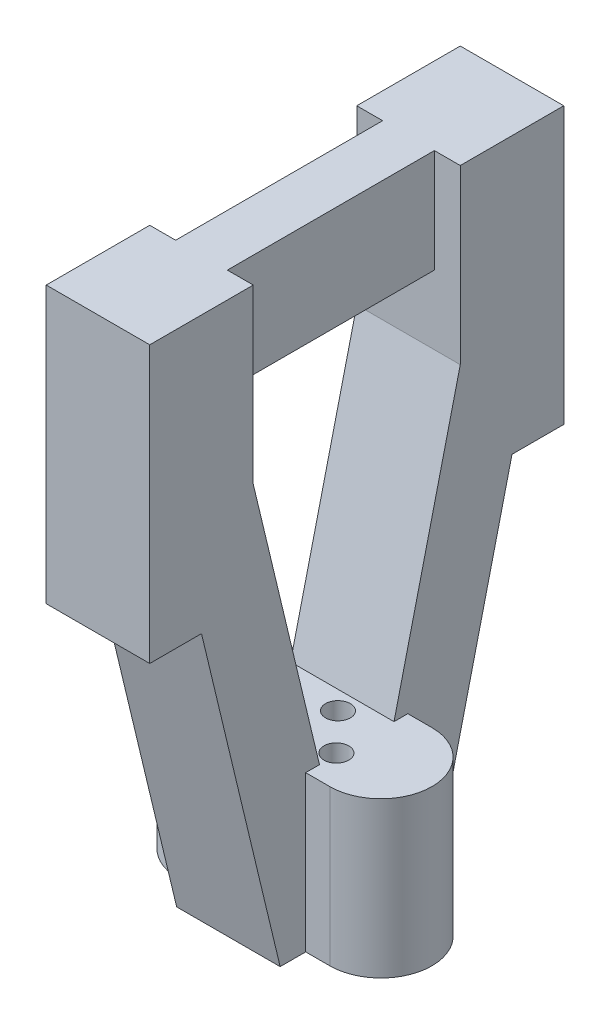
ISO-10303-21;
HEADER;
FILE_DESCRIPTION(('STEP AP214'),'2;1');
FILE_NAME('part.step','',(''),(''),'','','');
FILE_SCHEMA(('AUTOMOTIVE_DESIGN { 1 0 10303 214 1 1 1 1 }'));
ENDSEC;
DATA;
#1=APPLICATION_CONTEXT('core data for automotive mechanical design processes');
#2=APPLICATION_PROTOCOL_DEFINITION('international standard','automotive_design',2000,#1);
#3=PRODUCT_CONTEXT('',#1,'mechanical');
#4=PRODUCT('Part','Part','',(#3));
#5=PRODUCT_RELATED_PRODUCT_CATEGORY('part','',(#4));
#6=PRODUCT_DEFINITION_FORMATION('','',#4);
#7=PRODUCT_DEFINITION_CONTEXT('part definition',#1,'design');
#8=PRODUCT_DEFINITION('design','',#6,#7);
#9=PRODUCT_DEFINITION_SHAPE('','',#8);
#10=(LENGTH_UNIT() NAMED_UNIT(*) SI_UNIT(.MILLI.,.METRE.));
#11=(NAMED_UNIT(*) PLANE_ANGLE_UNIT() SI_UNIT($,.RADIAN.));
#12=(NAMED_UNIT(*) SI_UNIT($,.STERADIAN.) SOLID_ANGLE_UNIT());
#13=UNCERTAINTY_MEASURE_WITH_UNIT(LENGTH_MEASURE(1.E-05),#10,'distance_accuracy_value','');
#14=(GEOMETRIC_REPRESENTATION_CONTEXT(3) GLOBAL_UNCERTAINTY_ASSIGNED_CONTEXT((#13)) GLOBAL_UNIT_ASSIGNED_CONTEXT((#10,
#11,#12)) REPRESENTATION_CONTEXT('',''));
#15=CARTESIAN_POINT('',(0.,0.,0.));
#16=DIRECTION('',(0.,0.,1.));
#17=DIRECTION('',(1.,0.,0.));
#18=AXIS2_PLACEMENT_3D('',#15,#16,#17);
#19=CARTESIAN_POINT('',(-1.5,17.5,3.));
#20=DIRECTION('',(0.,0.,-1.));
#21=DIRECTION('',(0.,1.,0.));
#22=AXIS2_PLACEMENT_3D('',#19,#20,#21);
#23=PLANE('',#22);
#24=DIRECTION('',(-1.,0.,0.));
#25=VECTOR('',#24,1.);
#26=CARTESIAN_POINT('',(-0.75,14.5,3.));
#27=LINE('',#26,#25);
#28=CARTESIAN_POINT('',(0.749999999999999,14.5,3.));
#29=VERTEX_POINT('',#28);
#30=CARTESIAN_POINT('',(-0.75,14.5,3.));
#31=VERTEX_POINT('',#30);
#32=EDGE_CURVE('E49',#29,#31,#27,.T.);
#33=ORIENTED_EDGE('',*,*,#32,.F.);
#34=DIRECTION('',(0.,-1.,0.));
#35=VECTOR('',#34,1.);
#36=CARTESIAN_POINT('',(0.75,17.5,3.));
#37=LINE('',#36,#35);
#38=CARTESIAN_POINT('',(0.75,17.5,3.));
#39=VERTEX_POINT('',#38);
#40=EDGE_CURVE('E761',#39,#29,#37,.T.);
#41=ORIENTED_EDGE('',*,*,#40,.F.);
#42=DIRECTION('',(1.,0.,0.));
#43=VECTOR('',#42,1.);
#44=CARTESIAN_POINT('',(-1.5,17.5,3.));
#45=LINE('',#44,#43);
#46=CARTESIAN_POINT('',(1.5,17.5,3.));
#47=VERTEX_POINT('',#46);
#48=EDGE_CURVE('E336',#39,#47,#45,.T.);
#49=ORIENTED_EDGE('',*,*,#48,.T.);
#50=DIRECTION('',(0.,1.,0.));
#51=VECTOR('',#50,1.);
#52=CARTESIAN_POINT('',(1.5,17.5,3.));
#53=LINE('',#52,#51);
#54=CARTESIAN_POINT('',(1.5,12.5,3.));
#55=VERTEX_POINT('',#54);
#56=EDGE_CURVE('E298',#55,#47,#53,.T.);
#57=ORIENTED_EDGE('',*,*,#56,.F.);
#58=DIRECTION('',(1.,0.,0.));
#59=VECTOR('',#58,1.);
#60=CARTESIAN_POINT('',(-1.5,12.5,3.));
#61=LINE('',#60,#59);
#62=CARTESIAN_POINT('',(-1.5,12.5,3.));
#63=VERTEX_POINT('',#62);
#64=EDGE_CURVE('E337',#63,#55,#61,.T.);
#65=ORIENTED_EDGE('',*,*,#64,.F.);
#66=DIRECTION('',(0.,1.,0.));
#67=VECTOR('',#66,1.);
#68=CARTESIAN_POINT('',(-1.5,17.5,3.));
#69=LINE('',#68,#67);
#70=CARTESIAN_POINT('',(-1.5,17.5,3.));
#71=VERTEX_POINT('',#70);
#72=EDGE_CURVE('E317',#63,#71,#69,.T.);
#73=ORIENTED_EDGE('',*,*,#72,.T.);
#74=CARTESIAN_POINT('',(-0.75,17.5,3.));
#75=VERTEX_POINT('',#74);
#76=EDGE_CURVE('E349',#71,#75,#45,.T.);
#77=ORIENTED_EDGE('',*,*,#76,.T.);
#78=DIRECTION('',(0.,1.,0.));
#79=VECTOR('',#78,1.);
#80=CARTESIAN_POINT('',(-0.75,17.5,3.));
#81=LINE('',#80,#79);
#82=EDGE_CURVE('E54',#31,#75,#81,.T.);
#83=ORIENTED_EDGE('',*,*,#82,.F.);
#84=EDGE_LOOP('',(#33,#41,#49,#57,#65,#73,#77,#83));
#85=FACE_BOUND('',#84,.T.);
#86=ADVANCED_FACE('F33',(#85),#23,.T.);
#87=CARTESIAN_POINT('',(-1.5,17.5,-3.));
#88=DIRECTION('',(0.,0.,-1.));
#89=DIRECTION('',(0.,1.,0.));
#90=AXIS2_PLACEMENT_3D('',#87,#88,#89);
#91=PLANE('',#90);
#92=DIRECTION('',(0.,1.,0.));
#93=VECTOR('',#92,1.);
#94=CARTESIAN_POINT('',(0.75,17.5,-3.));
#95=LINE('',#94,#93);
#96=CARTESIAN_POINT('',(0.75,14.5,-3.));
#97=VERTEX_POINT('',#96);
#98=CARTESIAN_POINT('',(0.75,17.5,-3.));
#99=VERTEX_POINT('',#98);
#100=EDGE_CURVE('E214',#97,#99,#95,.T.);
#101=ORIENTED_EDGE('',*,*,#100,.F.);
#102=DIRECTION('',(1.,0.,0.));
#103=VECTOR('',#102,1.);
#104=CARTESIAN_POINT('',(-0.75,14.5,-3.));
#105=LINE('',#104,#103);
#106=CARTESIAN_POINT('',(-0.75,14.5,-3.));
#107=VERTEX_POINT('',#106);
#108=EDGE_CURVE('E223',#107,#97,#105,.T.);
#109=ORIENTED_EDGE('',*,*,#108,.F.);
#110=DIRECTION('',(0.,-1.,0.));
#111=VECTOR('',#110,1.);
#112=CARTESIAN_POINT('',(-0.75,17.5,-3.));
#113=LINE('',#112,#111);
#114=CARTESIAN_POINT('',(-0.75,17.5,-3.));
#115=VERTEX_POINT('',#114);
#116=EDGE_CURVE('E209',#115,#107,#113,.T.);
#117=ORIENTED_EDGE('',*,*,#116,.F.);
#118=DIRECTION('',(1.,0.,0.));
#119=VECTOR('',#118,1.);
#120=CARTESIAN_POINT('',(-1.5,17.5,-3.));
#121=LINE('',#120,#119);
#122=CARTESIAN_POINT('',(-1.5,17.5,-3.));
#123=VERTEX_POINT('',#122);
#124=EDGE_CURVE('E221',#123,#115,#121,.T.);
#125=ORIENTED_EDGE('',*,*,#124,.F.);
#126=DIRECTION('',(0.,1.,0.));
#127=VECTOR('',#126,1.);
#128=CARTESIAN_POINT('',(-1.5,17.5,-3.));
#129=LINE('',#128,#127);
#130=CARTESIAN_POINT('',(-1.5,12.5,-3.));
#131=VERTEX_POINT('',#130);
#132=EDGE_CURVE('E397',#131,#123,#129,.T.);
#133=ORIENTED_EDGE('',*,*,#132,.F.);
#134=DIRECTION('',(1.,0.,0.));
#135=VECTOR('',#134,1.);
#136=CARTESIAN_POINT('',(-1.5,12.5,-3.));
#137=LINE('',#136,#135);
#138=CARTESIAN_POINT('',(1.5,12.5,-3.));
#139=VERTEX_POINT('',#138);
#140=EDGE_CURVE('E247',#131,#139,#137,.T.);
#141=ORIENTED_EDGE('',*,*,#140,.T.);
#142=DIRECTION('',(0.,1.,0.));
#143=VECTOR('',#142,1.);
#144=CARTESIAN_POINT('',(1.5,17.5,-3.));
#145=LINE('',#144,#143);
#146=CARTESIAN_POINT('',(1.5,17.5,-3.));
#147=VERTEX_POINT('',#146);
#148=EDGE_CURVE('E368',#139,#147,#145,.T.);
#149=ORIENTED_EDGE('',*,*,#148,.T.);
#150=EDGE_CURVE('E231',#99,#147,#121,.T.);
#151=ORIENTED_EDGE('',*,*,#150,.F.);
#152=EDGE_LOOP('',(#101,#109,#117,#125,#133,#141,#149,#151));
#153=FACE_BOUND('',#152,.T.);
#154=ADVANCED_FACE('F219',(#153),#91,.F.);
#155=CARTESIAN_POINT('',(-2.2,4.5,-1.48));
#156=DIRECTION('',(0.,0.,-1.));
#157=DIRECTION('',(-1.,0.,0.));
#158=AXIS2_PLACEMENT_3D('',#155,#156,#157);
#159=PLANE('',#158);
#160=DIRECTION('',(1.,0.,0.));
#161=VECTOR('',#160,1.);
#162=CARTESIAN_POINT('',(-2.2,0.,-1.48));
#163=LINE('',#162,#161);
#164=CARTESIAN_POINT('',(1.5,0.,-1.48));
#165=VERTEX_POINT('',#164);
#166=CARTESIAN_POINT('',(2.2,0.,-1.48));
#167=VERTEX_POINT('',#166);
#168=EDGE_CURVE('E277',#165,#167,#163,.T.);
#169=ORIENTED_EDGE('',*,*,#168,.F.);
#170=DIRECTION('',(0.,1.,0.));
#171=VECTOR('',#170,1.);
#172=CARTESIAN_POINT('',(1.5,4.5,-1.48));
#173=LINE('',#172,#171);
#174=CARTESIAN_POINT('',(1.5,4.5,-1.48));
#175=VERTEX_POINT('',#174);
#176=EDGE_CURVE('E230',#165,#175,#173,.T.);
#177=ORIENTED_EDGE('',*,*,#176,.T.);
#178=DIRECTION('',(1.,0.,0.));
#179=VECTOR('',#178,1.);
#180=CARTESIAN_POINT('',(-2.2,4.5,-1.48));
#181=LINE('',#180,#179);
#182=CARTESIAN_POINT('',(2.2,4.5,-1.48));
#183=VERTEX_POINT('',#182);
#184=EDGE_CURVE('E263',#175,#183,#181,.T.);
#185=ORIENTED_EDGE('',*,*,#184,.T.);
#186=DIRECTION('',(0.,-1.,0.));
#187=VECTOR('',#186,1.);
#188=CARTESIAN_POINT('',(2.2,4.5,-1.48));
#189=LINE('',#188,#187);
#190=EDGE_CURVE('E281',#183,#167,#189,.T.);
#191=ORIENTED_EDGE('',*,*,#190,.T.);
#192=EDGE_LOOP('',(#169,#177,#185,#191));
#193=FACE_BOUND('',#192,.T.);
#194=ADVANCED_FACE('F447',(#193),#159,.T.);
#195=CARTESIAN_POINT('',(-1.5,0.,0.));
#196=DIRECTION('',(-1.,0.,0.));
#197=DIRECTION('',(0.,0.,1.));
#198=AXIS2_PLACEMENT_3D('',#195,#196,#197);
#199=PLANE('',#198);
#200=DIRECTION('',(0.,0.,-1.));
#201=VECTOR('',#200,1.);
#202=CARTESIAN_POINT('',(-1.5,4.5,0.));
#203=LINE('',#202,#201);
#204=CARTESIAN_POINT('',(-1.5,4.5,1.48));
#205=VERTEX_POINT('',#204);
#206=CARTESIAN_POINT('',(-1.5,4.5,1.08));
#207=VERTEX_POINT('',#206);
#208=EDGE_CURVE('E293',#205,#207,#203,.T.);
#209=ORIENTED_EDGE('',*,*,#208,.F.);
#210=DIRECTION('',(0.,-1.,0.));
#211=VECTOR('',#210,1.);
#212=CARTESIAN_POINT('',(-1.5,0.,1.48));
#213=LINE('',#212,#211);
#214=CARTESIAN_POINT('',(-1.5,0.,1.48));
#215=VERTEX_POINT('',#214);
#216=EDGE_CURVE('E296',#205,#215,#213,.T.);
#217=ORIENTED_EDGE('',*,*,#216,.T.);
#218=DIRECTION('',(0.,0.,-1.));
#219=VECTOR('',#218,1.);
#220=CARTESIAN_POINT('',(-1.5,0.,0.));
#221=LINE('',#220,#219);
#222=CARTESIAN_POINT('',(-1.5,0.,2.22));
#223=VERTEX_POINT('',#222);
#224=EDGE_CURVE('E331',#223,#215,#221,.T.);
#225=ORIENTED_EDGE('',*,*,#224,.F.);
#226=DIRECTION('',(0.,-0.972387301980517,-0.233372952475324));
#227=VECTOR('',#226,1.);
#228=CARTESIAN_POINT('',(-1.5,0.,2.22));
#229=LINE('',#228,#227);
#230=CARTESIAN_POINT('',(-1.5,9.5,4.5));
#231=VERTEX_POINT('',#230);
#232=EDGE_CURVE('E328',#231,#223,#229,.T.);
#233=ORIENTED_EDGE('',*,*,#232,.F.);
#234=DIRECTION('',(0.,0.,-1.));
#235=VECTOR('',#234,1.);
#236=CARTESIAN_POINT('',(-1.5,9.5,6.));
#237=LINE('',#236,#235);
#238=CARTESIAN_POINT('',(-1.5,9.5,6.));
#239=VERTEX_POINT('',#238);
#240=EDGE_CURVE('E325',#239,#231,#237,.T.);
#241=ORIENTED_EDGE('',*,*,#240,.F.);
#242=DIRECTION('',(0.,-1.,0.));
#243=VECTOR('',#242,1.);
#244=CARTESIAN_POINT('',(-1.5,17.5,6.));
#245=LINE('',#244,#243);
#246=CARTESIAN_POINT('',(-1.5,17.5,6.));
#247=VERTEX_POINT('',#246);
#248=EDGE_CURVE('E323',#247,#239,#245,.T.);
#249=ORIENTED_EDGE('',*,*,#248,.F.);
#250=DIRECTION('',(0.,0.,1.));
#251=VECTOR('',#250,1.);
#252=CARTESIAN_POINT('',(-1.5,17.5,3.));
#253=LINE('',#252,#251);
#254=EDGE_CURVE('E320',#71,#247,#253,.T.);
#255=ORIENTED_EDGE('',*,*,#254,.F.);
#256=ORIENTED_EDGE('',*,*,#72,.F.);
#257=DIRECTION('',(0.,0.972387301980517,0.233372952475324));
#258=VECTOR('',#257,1.);
#259=CARTESIAN_POINT('',(-1.5,12.5,3.));
#260=LINE('',#259,#258);
#261=EDGE_CURVE('E334',#207,#63,#260,.T.);
#262=ORIENTED_EDGE('',*,*,#261,.F.);
#263=EDGE_LOOP('',(#209,#217,#225,#233,#241,#249,#255,#256,#262));
#264=FACE_BOUND('',#263,.T.);
#265=ADVANCED_FACE('F469',(#264),#199,.T.);
#266=CARTESIAN_POINT('',(1.5,0.,0.));
#267=DIRECTION('',(-1.,0.,0.));
#268=DIRECTION('',(0.,0.,1.));
#269=AXIS2_PLACEMENT_3D('',#266,#267,#268);
#270=PLANE('',#269);
#271=DIRECTION('',(0.,-1.,0.));
#272=VECTOR('',#271,1.);
#273=CARTESIAN_POINT('',(1.5,0.,1.48));
#274=LINE('',#273,#272);
#275=CARTESIAN_POINT('',(1.5,4.5,1.48));
#276=VERTEX_POINT('',#275);
#277=CARTESIAN_POINT('',(1.5,0.,1.48));
#278=VERTEX_POINT('',#277);
#279=EDGE_CURVE('E352',#276,#278,#274,.T.);
#280=ORIENTED_EDGE('',*,*,#279,.F.);
#281=DIRECTION('',(0.,0.,-1.));
#282=VECTOR('',#281,1.);
#283=CARTESIAN_POINT('',(1.5,4.5,0.));
#284=LINE('',#283,#282);
#285=CARTESIAN_POINT('',(1.5,4.5,1.08));
#286=VERTEX_POINT('',#285);
#287=EDGE_CURVE('E340',#276,#286,#284,.T.);
#288=ORIENTED_EDGE('',*,*,#287,.T.);
#289=DIRECTION('',(0.,0.972387301980517,0.233372952475324));
#290=VECTOR('',#289,1.);
#291=CARTESIAN_POINT('',(1.5,12.5,3.));
#292=LINE('',#291,#290);
#293=EDGE_CURVE('E315',#286,#55,#292,.T.);
#294=ORIENTED_EDGE('',*,*,#293,.T.);
#295=ORIENTED_EDGE('',*,*,#56,.T.);
#296=DIRECTION('',(0.,0.,1.));
#297=VECTOR('',#296,1.);
#298=CARTESIAN_POINT('',(1.5,17.5,3.));
#299=LINE('',#298,#297);
#300=CARTESIAN_POINT('',(1.5,17.5,6.));
#301=VERTEX_POINT('',#300);
#302=EDGE_CURVE('E301',#47,#301,#299,.T.);
#303=ORIENTED_EDGE('',*,*,#302,.T.);
#304=DIRECTION('',(0.,-1.,0.));
#305=VECTOR('',#304,1.);
#306=CARTESIAN_POINT('',(1.5,17.5,6.));
#307=LINE('',#306,#305);
#308=CARTESIAN_POINT('',(1.5,9.5,6.));
#309=VERTEX_POINT('',#308);
#310=EDGE_CURVE('E304',#301,#309,#307,.T.);
#311=ORIENTED_EDGE('',*,*,#310,.T.);
#312=DIRECTION('',(0.,0.,-1.));
#313=VECTOR('',#312,1.);
#314=CARTESIAN_POINT('',(1.5,9.5,6.));
#315=LINE('',#314,#313);
#316=CARTESIAN_POINT('',(1.5,9.5,4.5));
#317=VERTEX_POINT('',#316);
#318=EDGE_CURVE('E307',#309,#317,#315,.T.);
#319=ORIENTED_EDGE('',*,*,#318,.T.);
#320=DIRECTION('',(0.,-0.972387301980517,-0.233372952475324));
#321=VECTOR('',#320,1.);
#322=CARTESIAN_POINT('',(1.5,0.,2.22));
#323=LINE('',#322,#321);
#324=CARTESIAN_POINT('',(1.5,0.,2.22));
#325=VERTEX_POINT('',#324);
#326=EDGE_CURVE('E310',#317,#325,#323,.T.);
#327=ORIENTED_EDGE('',*,*,#326,.T.);
#328=DIRECTION('',(0.,0.,-1.));
#329=VECTOR('',#328,1.);
#330=CARTESIAN_POINT('',(1.5,0.,0.));
#331=LINE('',#330,#329);
#332=EDGE_CURVE('E313',#325,#278,#331,.T.);
#333=ORIENTED_EDGE('',*,*,#332,.T.);
#334=EDGE_LOOP('',(#280,#288,#294,#295,#303,#311,#319,#327,#333));
#335=FACE_BOUND('',#334,.T.);
#336=ADVANCED_FACE('F461',(#335),#270,.F.);
#337=CARTESIAN_POINT('',(-1.5,12.5,3.));
#338=DIRECTION('',(0.,0.233372952475324,-0.972387301980517));
#339=DIRECTION('',(0.,0.972387301980518,0.233372952475324));
#340=AXIS2_PLACEMENT_3D('',#337,#338,#339);
#341=PLANE('',#340);
#342=DIRECTION('',(1.,0.,0.));
#343=VECTOR('',#342,1.);
#344=CARTESIAN_POINT('',(-1.5,4.5,1.08));
#345=LINE('',#344,#343);
#346=EDGE_CURVE('E290',#207,#286,#345,.T.);
#347=ORIENTED_EDGE('',*,*,#346,.F.);
#348=ORIENTED_EDGE('',*,*,#261,.T.);
#349=ORIENTED_EDGE('',*,*,#64,.T.);
#350=ORIENTED_EDGE('',*,*,#293,.F.);
#351=EDGE_LOOP('',(#347,#348,#349,#350));
#352=FACE_BOUND('',#351,.T.);
#353=ADVANCED_FACE('F465',(#352),#341,.T.);
#354=CARTESIAN_POINT('',(-1.5,0.,0.));
#355=DIRECTION('',(0.,-1.,0.));
#356=DIRECTION('',(0.,0.,-1.));
#357=AXIS2_PLACEMENT_3D('',#354,#355,#356);
#358=PLANE('',#357);
#359=CARTESIAN_POINT('',(-2.25,0.,0.));
#360=DIRECTION('',(0.,1.,0.));
#361=DIRECTION('',(0.,0.,1.));
#362=AXIS2_PLACEMENT_3D('',#359,#360,#361);
#363=CIRCLE('',#362,0.63);
#364=CARTESIAN_POINT('',(-2.25,0.,0.63));
#365=VERTEX_POINT('',#364);
#366=EDGE_CURVE('E363',#365,#365,#363,.T.);
#367=ORIENTED_EDGE('',*,*,#366,.T.);
#368=EDGE_LOOP('',(#367));
#369=FACE_BOUND('',#368,.T.);
#370=CARTESIAN_POINT('',(0.414349108092387,0.,-0.541981392860774));
#371=DIRECTION('',(0.,1.,0.));
#372=DIRECTION('',(0.,0.,1.));
#373=AXIS2_PLACEMENT_3D('',#370,#371,#372);
#374=CIRCLE('',#373,0.36);
#375=CARTESIAN_POINT('',(0.414349108092387,0.,-0.181981392860774));
#376=VERTEX_POINT('',#375);
#377=EDGE_CURVE('E756',#376,#376,#374,.T.);
#378=ORIENTED_EDGE('',*,*,#377,.T.);
#379=EDGE_LOOP('',(#378));
#380=FACE_BOUND('',#379,.T.);
#381=CARTESIAN_POINT('',(1.45118307704343,0.,0.541981392860775));
#382=DIRECTION('',(0.,1.,0.));
#383=DIRECTION('',(0.,0.,1.));
#384=AXIS2_PLACEMENT_3D('',#381,#382,#383);
#385=CIRCLE('',#384,0.36);
#386=CARTESIAN_POINT('',(1.45118307704343,0.,0.901981392860775));
#387=VERTEX_POINT('',#386);
#388=EDGE_CURVE('E380',#387,#387,#385,.T.);
#389=ORIENTED_EDGE('',*,*,#388,.T.);
#390=EDGE_LOOP('',(#389));
#391=FACE_BOUND('',#390,.T.);
#392=CARTESIAN_POINT('',(-2.2,0.,-1.48));
#393=VERTEX_POINT('',#392);
#394=CARTESIAN_POINT('',(-1.5,0.,-1.48));
#395=VERTEX_POINT('',#394);
#396=EDGE_CURVE('E256',#393,#395,#163,.T.);
#397=ORIENTED_EDGE('',*,*,#396,.T.);
#398=DIRECTION('',(0.,0.,1.));
#399=VECTOR('',#398,1.);
#400=CARTESIAN_POINT('',(-1.5,0.,0.));
#401=LINE('',#400,#399);
#402=CARTESIAN_POINT('',(-1.5,0.,-2.22));
#403=VERTEX_POINT('',#402);
#404=EDGE_CURVE('E401',#403,#395,#401,.T.);
#405=ORIENTED_EDGE('',*,*,#404,.F.);
#406=DIRECTION('',(1.,0.,0.));
#407=VECTOR('',#406,1.);
#408=CARTESIAN_POINT('',(-1.5,0.,-2.22));
#409=LINE('',#408,#407);
#410=CARTESIAN_POINT('',(1.5,0.,-2.22));
#411=VERTEX_POINT('',#410);
#412=EDGE_CURVE('E245',#403,#411,#409,.T.);
#413=ORIENTED_EDGE('',*,*,#412,.T.);
#414=DIRECTION('',(0.,0.,1.));
#415=VECTOR('',#414,1.);
#416=CARTESIAN_POINT('',(1.5,0.,0.));
#417=LINE('',#416,#415);
#418=EDGE_CURVE('E377',#411,#165,#417,.T.);
#419=ORIENTED_EDGE('',*,*,#418,.T.);
#420=ORIENTED_EDGE('',*,*,#168,.T.);
#421=CARTESIAN_POINT('',(2.2,0.,0.));
#422=DIRECTION('',(0.,1.,0.));
#423=DIRECTION('',(0.,0.,1.));
#424=AXIS2_PLACEMENT_3D('',#421,#422,#423);
#425=CIRCLE('',#424,1.48);
#426=CARTESIAN_POINT('',(2.2,0.,1.48));
#427=VERTEX_POINT('',#426);
#428=EDGE_CURVE('E274',#427,#167,#425,.T.);
#429=ORIENTED_EDGE('',*,*,#428,.F.);
#430=DIRECTION('',(1.,0.,0.));
#431=VECTOR('',#430,1.);
#432=CARTESIAN_POINT('',(-2.2,0.,1.48));
#433=LINE('',#432,#431);
#434=EDGE_CURVE('E270',#278,#427,#433,.T.);
#435=ORIENTED_EDGE('',*,*,#434,.F.);
#436=ORIENTED_EDGE('',*,*,#332,.F.);
#437=DIRECTION('',(1.,0.,0.));
#438=VECTOR('',#437,1.);
#439=CARTESIAN_POINT('',(-1.5,0.,2.22));
#440=LINE('',#439,#438);
#441=EDGE_CURVE('E341',#223,#325,#440,.T.);
#442=ORIENTED_EDGE('',*,*,#441,.F.);
#443=ORIENTED_EDGE('',*,*,#224,.T.);
#444=CARTESIAN_POINT('',(-2.2,0.,1.48));
#445=VERTEX_POINT('',#444);
#446=EDGE_CURVE('E271',#445,#215,#433,.T.);
#447=ORIENTED_EDGE('',*,*,#446,.F.);
#448=CARTESIAN_POINT('',(-2.2,0.,0.));
#449=DIRECTION('',(0.,1.,0.));
#450=DIRECTION('',(0.,0.,1.));
#451=AXIS2_PLACEMENT_3D('',#448,#449,#450);
#452=CIRCLE('',#451,1.48);
#453=EDGE_CURVE('E251',#393,#445,#452,.T.);
#454=ORIENTED_EDGE('',*,*,#453,.F.);
#455=EDGE_LOOP('',(#397,#405,#413,#419,#420,#429,#435,#436,#442,#443,#447,#454));
#456=FACE_BOUND('',#455,.T.);
#457=ADVANCED_FACE('F429',(#369,#380,#391,#456),#358,.T.);
#458=CARTESIAN_POINT('',(-1.5,0.,2.22));
#459=DIRECTION('',(0.,-0.233372952475324,0.972387301980517));
#460=DIRECTION('',(0.,-0.972387301980518,-0.233372952475324));
#461=AXIS2_PLACEMENT_3D('',#458,#459,#460);
#462=PLANE('',#461);
#463=ORIENTED_EDGE('',*,*,#441,.T.);
#464=ORIENTED_EDGE('',*,*,#326,.F.);
#465=DIRECTION('',(1.,0.,0.));
#466=VECTOR('',#465,1.);
#467=CARTESIAN_POINT('',(-1.5,9.5,4.5));
#468=LINE('',#467,#466);
#469=EDGE_CURVE('E343',#231,#317,#468,.T.);
#470=ORIENTED_EDGE('',*,*,#469,.F.);
#471=ORIENTED_EDGE('',*,*,#232,.T.);
#472=EDGE_LOOP('',(#463,#464,#470,#471));
#473=FACE_BOUND('',#472,.T.);
#474=ADVANCED_FACE('F486',(#473),#462,.T.);
#475=CARTESIAN_POINT('',(-1.5,9.5,6.));
#476=DIRECTION('',(0.,-1.,0.));
#477=DIRECTION('',(0.,0.,-1.));
#478=AXIS2_PLACEMENT_3D('',#475,#476,#477);
#479=PLANE('',#478);
#480=ORIENTED_EDGE('',*,*,#469,.T.);
#481=ORIENTED_EDGE('',*,*,#318,.F.);
#482=DIRECTION('',(1.,0.,0.));
#483=VECTOR('',#482,1.);
#484=CARTESIAN_POINT('',(-1.5,9.5,6.));
#485=LINE('',#484,#483);
#486=EDGE_CURVE('E345',#239,#309,#485,.T.);
#487=ORIENTED_EDGE('',*,*,#486,.F.);
#488=ORIENTED_EDGE('',*,*,#240,.T.);
#489=EDGE_LOOP('',(#480,#481,#487,#488));
#490=FACE_BOUND('',#489,.T.);
#491=ADVANCED_FACE('F482',(#490),#479,.T.);
#492=CARTESIAN_POINT('',(-1.5,12.5,6.));
#493=DIRECTION('',(0.,0.,1.));
#494=DIRECTION('',(0.,-1.,0.));
#495=AXIS2_PLACEMENT_3D('',#492,#493,#494);
#496=PLANE('',#495);
#497=ORIENTED_EDGE('',*,*,#486,.T.);
#498=ORIENTED_EDGE('',*,*,#310,.F.);
#499=DIRECTION('',(1.,0.,0.));
#500=VECTOR('',#499,1.);
#501=CARTESIAN_POINT('',(-1.5,17.5,6.));
#502=LINE('',#501,#500);
#503=EDGE_CURVE('E347',#247,#301,#502,.T.);
#504=ORIENTED_EDGE('',*,*,#503,.F.);
#505=ORIENTED_EDGE('',*,*,#248,.T.);
#506=EDGE_LOOP('',(#497,#498,#504,#505));
#507=FACE_BOUND('',#506,.T.);
#508=ADVANCED_FACE('F478',(#507),#496,.T.);
#509=CARTESIAN_POINT('',(-1.5,17.5,3.));
#510=DIRECTION('',(0.,1.,0.));
#511=DIRECTION('',(0.,0.,1.));
#512=AXIS2_PLACEMENT_3D('',#509,#510,#511);
#513=PLANE('',#512);
#514=ORIENTED_EDGE('',*,*,#503,.T.);
#515=ORIENTED_EDGE('',*,*,#302,.F.);
#516=ORIENTED_EDGE('',*,*,#48,.F.);
#517=DIRECTION('',(0.,0.,-1.));
#518=VECTOR('',#517,1.);
#519=CARTESIAN_POINT('',(0.75,17.5,6.002));
#520=LINE('',#519,#518);
#521=EDGE_CURVE('E213',#39,#99,#520,.T.);
#522=ORIENTED_EDGE('',*,*,#521,.T.);
#523=ORIENTED_EDGE('',*,*,#150,.T.);
#524=DIRECTION('',(0.,0.,-1.));
#525=VECTOR('',#524,1.);
#526=CARTESIAN_POINT('',(1.5,17.5,-3.));
#527=LINE('',#526,#525);
#528=CARTESIAN_POINT('',(1.5,17.5,-6.));
#529=VERTEX_POINT('',#528);
#530=EDGE_CURVE('E394',#147,#529,#527,.T.);
#531=ORIENTED_EDGE('',*,*,#530,.T.);
#532=DIRECTION('',(1.,0.,0.));
#533=VECTOR('',#532,1.);
#534=CARTESIAN_POINT('',(-1.5,17.5,-6.));
#535=LINE('',#534,#533);
#536=CARTESIAN_POINT('',(-1.5,17.5,-6.));
#537=VERTEX_POINT('',#536);
#538=EDGE_CURVE('E236',#537,#529,#535,.T.);
#539=ORIENTED_EDGE('',*,*,#538,.F.);
#540=DIRECTION('',(0.,0.,-1.));
#541=VECTOR('',#540,1.);
#542=CARTESIAN_POINT('',(-1.5,17.5,-3.));
#543=LINE('',#542,#541);
#544=EDGE_CURVE('E228',#123,#537,#543,.T.);
#545=ORIENTED_EDGE('',*,*,#544,.F.);
#546=ORIENTED_EDGE('',*,*,#124,.T.);
#547=DIRECTION('',(0.,0.,-1.));
#548=VECTOR('',#547,1.);
#549=CARTESIAN_POINT('',(-0.75,17.5,6.002));
#550=LINE('',#549,#548);
#551=EDGE_CURVE('E205',#75,#115,#550,.T.);
#552=ORIENTED_EDGE('',*,*,#551,.F.);
#553=ORIENTED_EDGE('',*,*,#76,.F.);
#554=ORIENTED_EDGE('',*,*,#254,.T.);
#555=EDGE_LOOP('',(#514,#515,#516,#522,#523,#531,#539,#545,#546,#552,#553,#554));
#556=FACE_BOUND('',#555,.T.);
#557=ADVANCED_FACE('F225',(#556),#513,.T.);
#558=CARTESIAN_POINT('',(-2.2,4.5,1.48));
#559=DIRECTION('',(0.,0.,-1.));
#560=DIRECTION('',(-1.,0.,0.));
#561=AXIS2_PLACEMENT_3D('',#558,#559,#560);
#562=PLANE('',#561);
#563=DIRECTION('',(1.,0.,0.));
#564=VECTOR('',#563,1.);
#565=CARTESIAN_POINT('',(-2.2,4.5,1.48));
#566=LINE('',#565,#564);
#567=CARTESIAN_POINT('',(2.2,4.5,1.48));
#568=VERTEX_POINT('',#567);
#569=EDGE_CURVE('E255',#276,#568,#566,.T.);
#570=ORIENTED_EDGE('',*,*,#569,.F.);
#571=ORIENTED_EDGE('',*,*,#279,.T.);
#572=ORIENTED_EDGE('',*,*,#434,.T.);
#573=DIRECTION('',(0.,-1.,0.));
#574=VECTOR('',#573,1.);
#575=CARTESIAN_POINT('',(2.2,4.5,1.48));
#576=LINE('',#575,#574);
#577=EDGE_CURVE('E284',#568,#427,#576,.T.);
#578=ORIENTED_EDGE('',*,*,#577,.F.);
#579=EDGE_LOOP('',(#570,#571,#572,#578));
#580=FACE_BOUND('',#579,.T.);
#581=ADVANCED_FACE('F459',(#580),#562,.F.);
#582=CARTESIAN_POINT('',(-2.2,4.5,0.));
#583=DIRECTION('',(0.,-1.,0.));
#584=DIRECTION('',(0.,0.,-1.));
#585=AXIS2_PLACEMENT_3D('',#582,#583,#584);
#586=CYLINDRICAL_SURFACE('',#585,1.48);
#587=ORIENTED_EDGE('',*,*,#453,.T.);
#588=DIRECTION('',(0.,-1.,0.));
#589=VECTOR('',#588,1.);
#590=CARTESIAN_POINT('',(-2.2,4.5,1.48));
#591=LINE('',#590,#589);
#592=CARTESIAN_POINT('',(-2.2,4.5,1.48));
#593=VERTEX_POINT('',#592);
#594=EDGE_CURVE('E287',#593,#445,#591,.T.);
#595=ORIENTED_EDGE('',*,*,#594,.F.);
#596=CARTESIAN_POINT('',(-2.2,4.5,0.));
#597=DIRECTION('',(0.,1.,0.));
#598=DIRECTION('',(0.,0.,1.));
#599=AXIS2_PLACEMENT_3D('',#596,#597,#598);
#600=CIRCLE('',#599,1.48);
#601=CARTESIAN_POINT('',(-2.2,4.5,-1.48));
#602=VERTEX_POINT('',#601);
#603=EDGE_CURVE('E252',#602,#593,#600,.T.);
#604=ORIENTED_EDGE('',*,*,#603,.F.);
#605=DIRECTION('',(0.,-1.,0.));
#606=VECTOR('',#605,1.);
#607=CARTESIAN_POINT('',(-2.2,4.5,-1.48));
#608=LINE('',#607,#606);
#609=EDGE_CURVE('E267',#602,#393,#608,.T.);
#610=ORIENTED_EDGE('',*,*,#609,.T.);
#611=EDGE_LOOP('',(#587,#595,#604,#610));
#612=FACE_BOUND('',#611,.T.);
#613=ADVANCED_FACE('F492',(#612),#586,.T.);
#614=ORIENTED_EDGE('',*,*,#216,.F.);
#615=EDGE_CURVE('E257',#593,#205,#566,.T.);
#616=ORIENTED_EDGE('',*,*,#615,.F.);
#617=ORIENTED_EDGE('',*,*,#594,.T.);
#618=ORIENTED_EDGE('',*,*,#446,.T.);
#619=EDGE_LOOP('',(#614,#616,#617,#618));
#620=FACE_BOUND('',#619,.T.);
#621=ADVANCED_FACE('F489',(#620),#562,.F.);
#622=CARTESIAN_POINT('',(2.2,4.5,0.));
#623=DIRECTION('',(0.,-1.,0.));
#624=DIRECTION('',(0.,0.,-1.));
#625=AXIS2_PLACEMENT_3D('',#622,#623,#624);
#626=CYLINDRICAL_SURFACE('',#625,1.48);
#627=ORIENTED_EDGE('',*,*,#428,.T.);
#628=ORIENTED_EDGE('',*,*,#190,.F.);
#629=CARTESIAN_POINT('',(2.2,4.5,0.));
#630=DIRECTION('',(0.,1.,0.));
#631=DIRECTION('',(0.,0.,1.));
#632=AXIS2_PLACEMENT_3D('',#629,#630,#631);
#633=CIRCLE('',#632,1.48);
#634=EDGE_CURVE('E260',#568,#183,#633,.T.);
#635=ORIENTED_EDGE('',*,*,#634,.F.);
#636=ORIENTED_EDGE('',*,*,#577,.T.);
#637=EDGE_LOOP('',(#627,#628,#635,#636));
#638=FACE_BOUND('',#637,.T.);
#639=ADVANCED_FACE('F454',(#638),#626,.T.);
#640=DIRECTION('',(0.,1.,0.));
#641=VECTOR('',#640,1.);
#642=CARTESIAN_POINT('',(-1.5,4.5,-1.48));
#643=LINE('',#642,#641);
#644=CARTESIAN_POINT('',(-1.5,4.5,-1.48));
#645=VERTEX_POINT('',#644);
#646=EDGE_CURVE('E234',#395,#645,#643,.T.);
#647=ORIENTED_EDGE('',*,*,#646,.F.);
#648=ORIENTED_EDGE('',*,*,#396,.F.);
#649=ORIENTED_EDGE('',*,*,#609,.F.);
#650=EDGE_CURVE('E264',#602,#645,#181,.T.);
#651=ORIENTED_EDGE('',*,*,#650,.T.);
#652=EDGE_LOOP('',(#647,#648,#649,#651));
#653=FACE_BOUND('',#652,.T.);
#654=ADVANCED_FACE('F433',(#653),#159,.T.);
#655=CARTESIAN_POINT('',(-2.2,4.5,0.));
#656=DIRECTION('',(0.,1.,0.));
#657=DIRECTION('',(0.,0.,1.));
#658=AXIS2_PLACEMENT_3D('',#655,#656,#657);
#659=PLANE('',#658);
#660=CARTESIAN_POINT('',(-2.25,4.5,0.));
#661=DIRECTION('',(0.,1.,0.));
#662=DIRECTION('',(0.,0.,1.));
#663=AXIS2_PLACEMENT_3D('',#660,#661,#662);
#664=CIRCLE('',#663,0.63);
#665=CARTESIAN_POINT('',(-2.25,4.5,0.63));
#666=VERTEX_POINT('',#665);
#667=EDGE_CURVE('E36',#666,#666,#664,.F.);
#668=ORIENTED_EDGE('',*,*,#667,.T.);
#669=EDGE_LOOP('',(#668));
#670=FACE_BOUND('',#669,.T.);
#671=CARTESIAN_POINT('',(0.414349108092387,4.5,-0.541981392860774));
#672=DIRECTION('',(0.,1.,0.));
#673=DIRECTION('',(0.,0.,1.));
#674=AXIS2_PLACEMENT_3D('',#671,#672,#673);
#675=CIRCLE('',#674,0.36);
#676=CARTESIAN_POINT('',(0.414349108092387,4.5,-0.181981392860774));
#677=VERTEX_POINT('',#676);
#678=EDGE_CURVE('E362',#677,#677,#675,.F.);
#679=ORIENTED_EDGE('',*,*,#678,.T.);
#680=EDGE_LOOP('',(#679));
#681=FACE_BOUND('',#680,.T.);
#682=CARTESIAN_POINT('',(1.45118307704343,4.5,0.541981392860775));
#683=DIRECTION('',(0.,1.,0.));
#684=DIRECTION('',(0.,0.,1.));
#685=AXIS2_PLACEMENT_3D('',#682,#683,#684);
#686=CIRCLE('',#685,0.36);
#687=CARTESIAN_POINT('',(1.45118307704343,4.5,0.901981392860775));
#688=VERTEX_POINT('',#687);
#689=EDGE_CURVE('E360',#688,#688,#686,.F.);
#690=ORIENTED_EDGE('',*,*,#689,.T.);
#691=EDGE_LOOP('',(#690));
#692=FACE_BOUND('',#691,.T.);
#693=DIRECTION('',(0.,0.,1.));
#694=VECTOR('',#693,1.);
#695=CARTESIAN_POINT('',(-1.5,4.5,0.));
#696=LINE('',#695,#694);
#697=CARTESIAN_POINT('',(-1.5,4.5,-1.08));
#698=VERTEX_POINT('',#697);
#699=EDGE_CURVE('E11',#645,#698,#696,.T.);
#700=ORIENTED_EDGE('',*,*,#699,.F.);
#701=ORIENTED_EDGE('',*,*,#650,.F.);
#702=ORIENTED_EDGE('',*,*,#603,.T.);
#703=ORIENTED_EDGE('',*,*,#615,.T.);
#704=ORIENTED_EDGE('',*,*,#208,.T.);
#705=ORIENTED_EDGE('',*,*,#346,.T.);
#706=ORIENTED_EDGE('',*,*,#287,.F.);
#707=ORIENTED_EDGE('',*,*,#569,.T.);
#708=ORIENTED_EDGE('',*,*,#634,.T.);
#709=ORIENTED_EDGE('',*,*,#184,.F.);
#710=DIRECTION('',(0.,0.,1.));
#711=VECTOR('',#710,1.);
#712=CARTESIAN_POINT('',(1.5,4.5,0.));
#713=LINE('',#712,#711);
#714=CARTESIAN_POINT('',(1.5,4.5,-1.08));
#715=VERTEX_POINT('',#714);
#716=EDGE_CURVE('E355',#175,#715,#713,.T.);
#717=ORIENTED_EDGE('',*,*,#716,.T.);
#718=DIRECTION('',(-1.,0.,0.));
#719=VECTOR('',#718,1.);
#720=CARTESIAN_POINT('',(-2.2,4.5,-1.08));
#721=LINE('',#720,#719);
#722=EDGE_CURVE('E41',#715,#698,#721,.T.);
#723=ORIENTED_EDGE('',*,*,#722,.T.);
#724=EDGE_LOOP('',(#700,#701,#702,#703,#704,#705,#706,#707,#708,#709,#717,#723));
#725=FACE_BOUND('',#724,.T.);
#726=ADVANCED_FACE('F439',(#670,#681,#692,#725),#659,.T.);
#727=CARTESIAN_POINT('',(-1.5,17.5,-6.));
#728=DIRECTION('',(0.,0.,1.));
#729=DIRECTION('',(1.,0.,0.));
#730=AXIS2_PLACEMENT_3D('',#727,#728,#729);
#731=PLANE('',#730);
#732=ORIENTED_EDGE('',*,*,#538,.T.);
#733=DIRECTION('',(0.,-1.,0.));
#734=VECTOR('',#733,1.);
#735=CARTESIAN_POINT('',(1.5,12.5,-6.));
#736=LINE('',#735,#734);
#737=CARTESIAN_POINT('',(1.5,9.5,-6.));
#738=VERTEX_POINT('',#737);
#739=EDGE_CURVE('E391',#529,#738,#736,.T.);
#740=ORIENTED_EDGE('',*,*,#739,.T.);
#741=DIRECTION('',(1.,0.,0.));
#742=VECTOR('',#741,1.);
#743=CARTESIAN_POINT('',(-1.5,9.5,-6.));
#744=LINE('',#743,#742);
#745=CARTESIAN_POINT('',(-1.5,9.5,-6.));
#746=VERTEX_POINT('',#745);
#747=EDGE_CURVE('E241',#746,#738,#744,.T.);
#748=ORIENTED_EDGE('',*,*,#747,.F.);
#749=DIRECTION('',(0.,-1.,0.));
#750=VECTOR('',#749,1.);
#751=CARTESIAN_POINT('',(-1.5,12.5,-6.));
#752=LINE('',#751,#750);
#753=EDGE_CURVE('E406',#537,#746,#752,.T.);
#754=ORIENTED_EDGE('',*,*,#753,.F.);
#755=EDGE_LOOP('',(#732,#740,#748,#754));
#756=FACE_BOUND('',#755,.T.);
#757=ADVANCED_FACE('F412',(#756),#731,.F.);
#758=CARTESIAN_POINT('',(-1.5,9.5,-6.));
#759=DIRECTION('',(0.,1.,0.));
#760=DIRECTION('',(0.,0.,1.));
#761=AXIS2_PLACEMENT_3D('',#758,#759,#760);
#762=PLANE('',#761);
#763=ORIENTED_EDGE('',*,*,#747,.T.);
#764=DIRECTION('',(0.,0.,1.));
#765=VECTOR('',#764,1.);
#766=CARTESIAN_POINT('',(1.5,9.5,-6.));
#767=LINE('',#766,#765);
#768=CARTESIAN_POINT('',(1.5,9.5,-4.5));
#769=VERTEX_POINT('',#768);
#770=EDGE_CURVE('E388',#738,#769,#767,.T.);
#771=ORIENTED_EDGE('',*,*,#770,.T.);
#772=DIRECTION('',(1.,0.,0.));
#773=VECTOR('',#772,1.);
#774=CARTESIAN_POINT('',(-1.5,9.5,-4.5));
#775=LINE('',#774,#773);
#776=CARTESIAN_POINT('',(-1.5,9.5,-4.5));
#777=VERTEX_POINT('',#776);
#778=EDGE_CURVE('E243',#777,#769,#775,.T.);
#779=ORIENTED_EDGE('',*,*,#778,.F.);
#780=DIRECTION('',(0.,0.,1.));
#781=VECTOR('',#780,1.);
#782=CARTESIAN_POINT('',(-1.5,9.5,-6.));
#783=LINE('',#782,#781);
#784=EDGE_CURVE('E405',#746,#777,#783,.T.);
#785=ORIENTED_EDGE('',*,*,#784,.F.);
#786=EDGE_LOOP('',(#763,#771,#779,#785));
#787=FACE_BOUND('',#786,.T.);
#788=ADVANCED_FACE('F420',(#787),#762,.F.);
#789=CARTESIAN_POINT('',(-1.5,0.,-2.22));
#790=DIRECTION('',(0.,0.233372952475324,0.972387301980517));
#791=DIRECTION('',(0.,-0.972387301980518,0.233372952475324));
#792=AXIS2_PLACEMENT_3D('',#789,#790,#791);
#793=PLANE('',#792);
#794=ORIENTED_EDGE('',*,*,#778,.T.);
#795=DIRECTION('',(0.,-0.972387301980517,0.233372952475324));
#796=VECTOR('',#795,1.);
#797=CARTESIAN_POINT('',(1.5,0.,-2.22));
#798=LINE('',#797,#796);
#799=EDGE_CURVE('E385',#769,#411,#798,.T.);
#800=ORIENTED_EDGE('',*,*,#799,.T.);
#801=ORIENTED_EDGE('',*,*,#412,.F.);
#802=DIRECTION('',(0.,-0.972387301980517,0.233372952475324));
#803=VECTOR('',#802,1.);
#804=CARTESIAN_POINT('',(-1.5,0.,-2.22));
#805=LINE('',#804,#803);
#806=EDGE_CURVE('E403',#777,#403,#805,.T.);
#807=ORIENTED_EDGE('',*,*,#806,.F.);
#808=EDGE_LOOP('',(#794,#800,#801,#807));
#809=FACE_BOUND('',#808,.T.);
#810=ADVANCED_FACE('F427',(#809),#793,.F.);
#811=CARTESIAN_POINT('',(-1.5,12.5,-3.));
#812=DIRECTION('',(0.,-0.233372952475324,-0.972387301980517));
#813=DIRECTION('',(0.,0.972387301980518,-0.233372952475324));
#814=AXIS2_PLACEMENT_3D('',#811,#812,#813);
#815=PLANE('',#814);
#816=ORIENTED_EDGE('',*,*,#722,.F.);
#817=DIRECTION('',(0.,0.972387301980517,-0.233372952475324));
#818=VECTOR('',#817,1.);
#819=CARTESIAN_POINT('',(1.5,12.5,-3.));
#820=LINE('',#819,#818);
#821=EDGE_CURVE('E372',#715,#139,#820,.T.);
#822=ORIENTED_EDGE('',*,*,#821,.T.);
#823=ORIENTED_EDGE('',*,*,#140,.F.);
#824=DIRECTION('',(0.,0.972387301980517,-0.233372952475324));
#825=VECTOR('',#824,1.);
#826=CARTESIAN_POINT('',(-1.5,12.5,-3.));
#827=LINE('',#826,#825);
#828=EDGE_CURVE('E399',#698,#131,#827,.T.);
#829=ORIENTED_EDGE('',*,*,#828,.F.);
#830=EDGE_LOOP('',(#816,#822,#823,#829));
#831=FACE_BOUND('',#830,.T.);
#832=ADVANCED_FACE('F443',(#831),#815,.F.);
#833=CARTESIAN_POINT('',(-1.5,0.,0.));
#834=DIRECTION('',(-1.,0.,0.));
#835=DIRECTION('',(0.,0.,-1.));
#836=AXIS2_PLACEMENT_3D('',#833,#834,#835);
#837=PLANE('',#836);
#838=ORIENTED_EDGE('',*,*,#404,.T.);
#839=ORIENTED_EDGE('',*,*,#646,.T.);
#840=ORIENTED_EDGE('',*,*,#699,.T.);
#841=ORIENTED_EDGE('',*,*,#828,.T.);
#842=ORIENTED_EDGE('',*,*,#132,.T.);
#843=ORIENTED_EDGE('',*,*,#544,.T.);
#844=ORIENTED_EDGE('',*,*,#753,.T.);
#845=ORIENTED_EDGE('',*,*,#784,.T.);
#846=ORIENTED_EDGE('',*,*,#806,.T.);
#847=EDGE_LOOP('',(#838,#839,#840,#841,#842,#843,#844,#845,#846));
#848=FACE_BOUND('',#847,.T.);
#849=ADVANCED_FACE('F409',(#848),#837,.T.);
#850=CARTESIAN_POINT('',(1.5,0.,0.));
#851=DIRECTION('',(-1.,0.,0.));
#852=DIRECTION('',(0.,0.,-1.));
#853=AXIS2_PLACEMENT_3D('',#850,#851,#852);
#854=PLANE('',#853);
#855=ORIENTED_EDGE('',*,*,#176,.F.);
#856=ORIENTED_EDGE('',*,*,#418,.F.);
#857=ORIENTED_EDGE('',*,*,#799,.F.);
#858=ORIENTED_EDGE('',*,*,#770,.F.);
#859=ORIENTED_EDGE('',*,*,#739,.F.);
#860=ORIENTED_EDGE('',*,*,#530,.F.);
#861=ORIENTED_EDGE('',*,*,#148,.F.);
#862=ORIENTED_EDGE('',*,*,#821,.F.);
#863=ORIENTED_EDGE('',*,*,#716,.F.);
#864=EDGE_LOOP('',(#855,#856,#857,#858,#859,#860,#861,#862,#863));
#865=FACE_BOUND('',#864,.T.);
#866=ADVANCED_FACE('F415',(#865),#854,.F.);
#867=CARTESIAN_POINT('',(1.45118307704343,17.5,0.541981392860775));
#868=DIRECTION('',(0.,-1.,0.));
#869=DIRECTION('',(0.,0.,-1.));
#870=AXIS2_PLACEMENT_3D('',#867,#868,#869);
#871=CYLINDRICAL_SURFACE('',#870,0.36);
#872=ORIENTED_EDGE('',*,*,#689,.F.);
#873=EDGE_LOOP('',(#872));
#874=FACE_BOUND('',#873,.T.);
#875=ORIENTED_EDGE('',*,*,#388,.F.);
#876=EDGE_LOOP('',(#875));
#877=FACE_BOUND('',#876,.T.);
#878=ADVANCED_FACE('F566',(#874,#877),#871,.F.);
#879=CARTESIAN_POINT('',(0.414349108092387,17.5,-0.541981392860774));
#880=DIRECTION('',(0.,-1.,0.));
#881=DIRECTION('',(0.,0.,-1.));
#882=AXIS2_PLACEMENT_3D('',#879,#880,#881);
#883=CYLINDRICAL_SURFACE('',#882,0.36);
#884=ORIENTED_EDGE('',*,*,#678,.F.);
#885=EDGE_LOOP('',(#884));
#886=FACE_BOUND('',#885,.T.);
#887=ORIENTED_EDGE('',*,*,#377,.F.);
#888=EDGE_LOOP('',(#887));
#889=FACE_BOUND('',#888,.T.);
#890=ADVANCED_FACE('F572',(#886,#889),#883,.F.);
#891=CARTESIAN_POINT('',(-2.25,17.5,0.));
#892=DIRECTION('',(0.,-1.,0.));
#893=DIRECTION('',(0.,0.,-1.));
#894=AXIS2_PLACEMENT_3D('',#891,#892,#893);
#895=CYLINDRICAL_SURFACE('',#894,0.63);
#896=ORIENTED_EDGE('',*,*,#667,.F.);
#897=EDGE_LOOP('',(#896));
#898=FACE_BOUND('',#897,.T.);
#899=ORIENTED_EDGE('',*,*,#366,.F.);
#900=EDGE_LOOP('',(#899));
#901=FACE_BOUND('',#900,.T.);
#902=ADVANCED_FACE('F580',(#898,#901),#895,.F.);
#903=CARTESIAN_POINT('',(0.75,17.5,6.002));
#904=DIRECTION('',(-1.,0.,0.));
#905=DIRECTION('',(0.,-1.,0.));
#906=AXIS2_PLACEMENT_3D('',#903,#904,#905);
#907=PLANE('',#906);
#908=ORIENTED_EDGE('',*,*,#521,.F.);
#909=ORIENTED_EDGE('',*,*,#40,.T.);
#910=DIRECTION('',(0.,0.,-1.));
#911=VECTOR('',#910,1.);
#912=CARTESIAN_POINT('',(0.75,14.5,6.002));
#913=LINE('',#912,#911);
#914=EDGE_CURVE('E769',#29,#97,#913,.T.);
#915=ORIENTED_EDGE('',*,*,#914,.T.);
#916=ORIENTED_EDGE('',*,*,#100,.T.);
#917=EDGE_LOOP('',(#908,#909,#915,#916));
#918=FACE_BOUND('',#917,.T.);
#919=ADVANCED_FACE('F588',(#918),#907,.F.);
#920=CARTESIAN_POINT('',(-0.75,17.5,6.002));
#921=DIRECTION('',(1.,0.,0.));
#922=DIRECTION('',(0.,0.,-1.));
#923=AXIS2_PLACEMENT_3D('',#920,#921,#922);
#924=PLANE('',#923);
#925=DIRECTION('',(0.,0.,-1.));
#926=VECTOR('',#925,1.);
#927=CARTESIAN_POINT('',(-0.75,14.5,6.002));
#928=LINE('',#927,#926);
#929=EDGE_CURVE('E765',#31,#107,#928,.T.);
#930=ORIENTED_EDGE('',*,*,#929,.F.);
#931=ORIENTED_EDGE('',*,*,#82,.T.);
#932=ORIENTED_EDGE('',*,*,#551,.T.);
#933=ORIENTED_EDGE('',*,*,#116,.T.);
#934=EDGE_LOOP('',(#930,#931,#932,#933));
#935=FACE_BOUND('',#934,.T.);
#936=ADVANCED_FACE('F208',(#935),#924,.F.);
#937=CARTESIAN_POINT('',(-0.75,14.5,6.002));
#938=DIRECTION('',(0.,1.,0.));
#939=DIRECTION('',(0.,0.,1.));
#940=AXIS2_PLACEMENT_3D('',#937,#938,#939);
#941=PLANE('',#940);
#942=ORIENTED_EDGE('',*,*,#914,.F.);
#943=ORIENTED_EDGE('',*,*,#32,.T.);
#944=ORIENTED_EDGE('',*,*,#929,.T.);
#945=ORIENTED_EDGE('',*,*,#108,.T.);
#946=EDGE_LOOP('',(#942,#943,#944,#945));
#947=FACE_BOUND('',#946,.T.);
#948=ADVANCED_FACE('F591',(#947),#941,.F.);
#949=CLOSED_SHELL('',(#86,#154,#194,#265,#336,#353,#457,#474,#491,#508,#557,#581,#613,#621,#639,
#654,#726,#757,#788,#810,#832,#849,#866,#878,#890,#902,#919,#936,#948));
#950=MANIFOLD_SOLID_BREP('B2',#949);
#951=ADVANCED_BREP_SHAPE_REPRESENTATION('',(#18,#950),#14);
#952=SHAPE_DEFINITION_REPRESENTATION(#9,#951);
ENDSEC;
END-ISO-10303-21;
